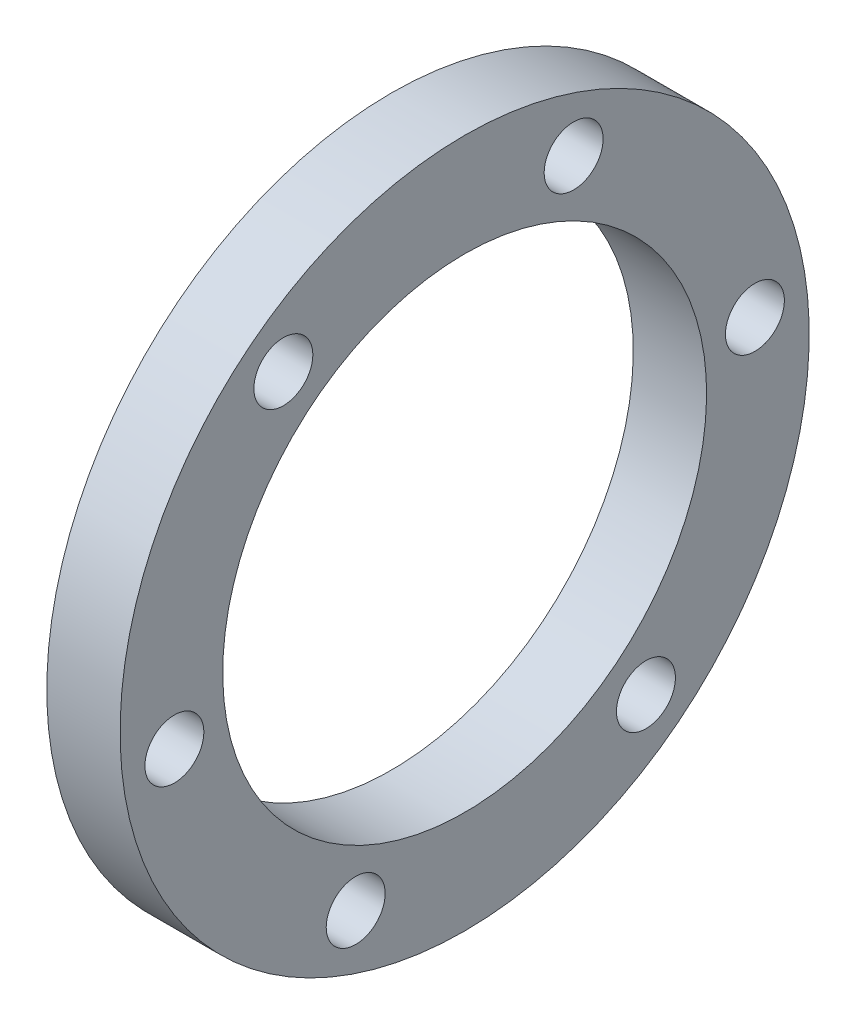
ISO-10303-21;
HEADER;
FILE_DESCRIPTION(('STEP AP214'),'2;1');
FILE_NAME('part.step','',(''),(''),'','','');
FILE_SCHEMA(('AUTOMOTIVE_DESIGN { 1 0 10303 214 1 1 1 1 }'));
ENDSEC;
DATA;
#1=APPLICATION_CONTEXT('core data for automotive mechanical design processes');
#2=APPLICATION_PROTOCOL_DEFINITION('international standard','automotive_design',2000,#1);
#3=PRODUCT_CONTEXT('',#1,'mechanical');
#4=PRODUCT('Part','Part','',(#3));
#5=PRODUCT_RELATED_PRODUCT_CATEGORY('part','',(#4));
#6=PRODUCT_DEFINITION_FORMATION('','',#4);
#7=PRODUCT_DEFINITION_CONTEXT('part definition',#1,'design');
#8=PRODUCT_DEFINITION('design','',#6,#7);
#9=PRODUCT_DEFINITION_SHAPE('','',#8);
#10=(LENGTH_UNIT() NAMED_UNIT(*) SI_UNIT(.MILLI.,.METRE.));
#11=(NAMED_UNIT(*) PLANE_ANGLE_UNIT() SI_UNIT($,.RADIAN.));
#12=(NAMED_UNIT(*) SI_UNIT($,.STERADIAN.) SOLID_ANGLE_UNIT());
#13=UNCERTAINTY_MEASURE_WITH_UNIT(LENGTH_MEASURE(1.E-05),#10,'distance_accuracy_value','');
#14=(GEOMETRIC_REPRESENTATION_CONTEXT(3) GLOBAL_UNCERTAINTY_ASSIGNED_CONTEXT((#13)) GLOBAL_UNIT_ASSIGNED_CONTEXT((#10,
#11,#12)) REPRESENTATION_CONTEXT('',''));
#15=CARTESIAN_POINT('',(0.,0.,0.));
#16=DIRECTION('',(0.,0.,1.));
#17=DIRECTION('',(1.,0.,0.));
#18=AXIS2_PLACEMENT_3D('',#15,#16,#17);
#19=CARTESIAN_POINT('',(-304.8,186.166852461199,298.45));
#20=DIRECTION('',(1.,0.,0.));
#21=DIRECTION('',(0.,1.,0.));
#22=AXIS2_PLACEMENT_3D('',#19,#20,#21);
#23=PLANE('',#22);
#24=CARTESIAN_POINT('',(-304.8,273.344767514925,253.729564328877));
#25=DIRECTION('',(1.,0.,0.));
#26=DIRECTION('',(0.,1.,0.));
#27=AXIS2_PLACEMENT_3D('',#24,#25,#26);
#28=CIRCLE('',#27,2.5527);
#29=CARTESIAN_POINT('',(-304.8,275.897467514925,253.729564328877));
#30=VERTEX_POINT('',#29);
#31=EDGE_CURVE('E42',#30,#30,#28,.F.);
#32=ORIENTED_EDGE('',*,*,#31,.T.);
#33=EDGE_LOOP('',(#32));
#34=FACE_BOUND('',#33,.T.);
#35=CARTESIAN_POINT('',(-304.8,316.890605835365,259.993745438182));
#36=DIRECTION('',(1.,0.,0.));
#37=DIRECTION('',(0.,1.,0.));
#38=AXIS2_PLACEMENT_3D('',#35,#36,#37);
#39=CIRCLE('',#38,2.5527);
#40=CARTESIAN_POINT('',(-304.8,319.443305835365,259.993745438182));
#41=VERTEX_POINT('',#40);
#42=EDGE_CURVE('E50',#41,#41,#39,.F.);
#43=ORIENTED_EDGE('',*,*,#42,.T.);
#44=EDGE_LOOP('',(#43));
#45=FACE_BOUND('',#44,.T.);
#46=CARTESIAN_POINT('',(-304.8,300.54262664971,219.14985266894));
#47=DIRECTION('',(1.,0.,0.));
#48=DIRECTION('',(0.,1.,0.));
#49=AXIS2_PLACEMENT_3D('',#46,#47,#48);
#50=CIRCLE('',#49,2.5527);
#51=CARTESIAN_POINT('',(-304.8,303.09532664971,219.14985266894));
#52=VERTEX_POINT('',#51);
#53=EDGE_CURVE('E58',#52,#52,#50,.F.);
#54=ORIENTED_EDGE('',*,*,#53,.T.);
#55=EDGE_LOOP('',(#54));
#56=FACE_BOUND('',#55,.T.);
#57=CARTESIAN_POINT('',(-304.8,296.926,244.291054145333));
#58=DIRECTION('',(1.,0.,0.));
#59=DIRECTION('',(0.,1.,0.));
#60=AXIS2_PLACEMENT_3D('',#57,#58,#59);
#61=CIRCLE('',#60,29.845);
#62=CARTESIAN_POINT('',(-304.8,326.771,244.291054145333));
#63=VERTEX_POINT('',#62);
#64=EDGE_CURVE('E19',#63,#63,#61,.T.);
#65=ORIENTED_EDGE('',*,*,#64,.T.);
#66=EDGE_LOOP('',(#65));
#67=FACE_BOUND('',#66,.T.);
#68=CARTESIAN_POINT('',(-304.8,276.961394164635,228.588362852483));
#69=DIRECTION('',(1.,0.,0.));
#70=DIRECTION('',(0.,1.,0.));
#71=AXIS2_PLACEMENT_3D('',#68,#69,#70);
#72=CIRCLE('',#71,2.5527);
#73=CARTESIAN_POINT('',(-304.8,279.514094164635,228.588362852483));
#74=VERTEX_POINT('',#73);
#75=EDGE_CURVE('E60',#74,#74,#72,.F.);
#76=ORIENTED_EDGE('',*,*,#75,.T.);
#77=EDGE_LOOP('',(#76));
#78=FACE_BOUND('',#77,.T.);
#79=CARTESIAN_POINT('',(-304.8,320.507232485074,234.852543961789));
#80=DIRECTION('',(1.,0.,0.));
#81=DIRECTION('',(0.,1.,0.));
#82=AXIS2_PLACEMENT_3D('',#79,#80,#81);
#83=CIRCLE('',#82,2.5527);
#84=CARTESIAN_POINT('',(-304.8,323.059932485074,234.852543961789));
#85=VERTEX_POINT('',#84);
#86=EDGE_CURVE('E54',#85,#85,#83,.F.);
#87=ORIENTED_EDGE('',*,*,#86,.T.);
#88=EDGE_LOOP('',(#87));
#89=FACE_BOUND('',#88,.T.);
#90=CARTESIAN_POINT('',(-304.8,293.30937335029,269.432255621727));
#91=DIRECTION('',(1.,0.,0.));
#92=DIRECTION('',(0.,1.,0.));
#93=AXIS2_PLACEMENT_3D('',#90,#91,#92);
#94=CIRCLE('',#93,2.5527);
#95=CARTESIAN_POINT('',(-304.8,295.86207335029,269.432255621727));
#96=VERTEX_POINT('',#95);
#97=EDGE_CURVE('E46',#96,#96,#94,.F.);
#98=ORIENTED_EDGE('',*,*,#97,.T.);
#99=EDGE_LOOP('',(#98));
#100=FACE_BOUND('',#99,.T.);
#101=CARTESIAN_POINT('',(-304.8,296.926,244.291054145333));
#102=DIRECTION('',(1.,0.,0.));
#103=DIRECTION('',(0.,1.,0.));
#104=AXIS2_PLACEMENT_3D('',#101,#102,#103);
#105=CIRCLE('',#104,20.955);
#106=CARTESIAN_POINT('',(-304.8,317.881,244.291054145333));
#107=VERTEX_POINT('',#106);
#108=EDGE_CURVE('E37',#107,#107,#105,.T.);
#109=ORIENTED_EDGE('',*,*,#108,.F.);
#110=EDGE_LOOP('',(#109));
#111=FACE_BOUND('',#110,.T.);
#112=ADVANCED_FACE('F15',(#34,#45,#56,#67,#78,#89,#100,#111),#23,.T.);
#113=CARTESIAN_POINT('',(-304.798,296.926,244.291054145333));
#114=DIRECTION('',(-1.,0.,0.));
#115=DIRECTION('',(0.,-1.,0.));
#116=AXIS2_PLACEMENT_3D('',#113,#114,#115);
#117=CYLINDRICAL_SURFACE('',#116,20.955);
#118=CARTESIAN_POINT('',(-311.15,296.926,244.291054145333));
#119=DIRECTION('',(1.,0.,0.));
#120=DIRECTION('',(0.,1.,0.));
#121=AXIS2_PLACEMENT_3D('',#118,#119,#120);
#122=CIRCLE('',#121,20.955);
#123=CARTESIAN_POINT('',(-311.15,317.881,244.291054145333));
#124=VERTEX_POINT('',#123);
#125=EDGE_CURVE('E98',#124,#124,#122,.T.);
#126=ORIENTED_EDGE('',*,*,#125,.F.);
#127=EDGE_LOOP('',(#126));
#128=FACE_BOUND('',#127,.T.);
#129=ORIENTED_EDGE('',*,*,#108,.T.);
#130=EDGE_LOOP('',(#129));
#131=FACE_BOUND('',#130,.T.);
#132=ADVANCED_FACE('F17',(#128,#131),#117,.F.);
#133=CARTESIAN_POINT('',(-304.798,273.344767514925,253.729564328877));
#134=DIRECTION('',(-1.,0.,0.));
#135=DIRECTION('',(0.,-1.,0.));
#136=AXIS2_PLACEMENT_3D('',#133,#134,#135);
#137=CYLINDRICAL_SURFACE('',#136,2.5527);
#138=CARTESIAN_POINT('',(-311.15,273.344767514925,253.729564328877));
#139=DIRECTION('',(-1.,0.,0.));
#140=DIRECTION('',(0.,-1.,0.));
#141=AXIS2_PLACEMENT_3D('',#138,#139,#140);
#142=CIRCLE('',#141,2.5527);
#143=CARTESIAN_POINT('',(-311.15,270.792067514925,253.729564328877));
#144=VERTEX_POINT('',#143);
#145=EDGE_CURVE('E103',#144,#144,#142,.T.);
#146=ORIENTED_EDGE('',*,*,#145,.T.);
#147=EDGE_LOOP('',(#146));
#148=FACE_BOUND('',#147,.T.);
#149=ORIENTED_EDGE('',*,*,#31,.F.);
#150=EDGE_LOOP('',(#149));
#151=FACE_BOUND('',#150,.T.);
#152=ADVANCED_FACE('F87',(#148,#151),#137,.F.);
#153=CARTESIAN_POINT('',(-304.798,293.30937335029,269.432255621727));
#154=DIRECTION('',(-1.,0.,0.));
#155=DIRECTION('',(0.,-1.,0.));
#156=AXIS2_PLACEMENT_3D('',#153,#154,#155);
#157=CYLINDRICAL_SURFACE('',#156,2.5527);
#158=CARTESIAN_POINT('',(-311.15,293.30937335029,269.432255621727));
#159=DIRECTION('',(-1.,0.,0.));
#160=DIRECTION('',(0.,-1.,0.));
#161=AXIS2_PLACEMENT_3D('',#158,#159,#160);
#162=CIRCLE('',#161,2.5527);
#163=CARTESIAN_POINT('',(-311.15,290.75667335029,269.432255621727));
#164=VERTEX_POINT('',#163);
#165=EDGE_CURVE('E107',#164,#164,#162,.T.);
#166=ORIENTED_EDGE('',*,*,#165,.T.);
#167=EDGE_LOOP('',(#166));
#168=FACE_BOUND('',#167,.T.);
#169=ORIENTED_EDGE('',*,*,#97,.F.);
#170=EDGE_LOOP('',(#169));
#171=FACE_BOUND('',#170,.T.);
#172=ADVANCED_FACE('F92',(#168,#171),#157,.F.);
#173=CARTESIAN_POINT('',(-304.798,316.890605835365,259.993745438182));
#174=DIRECTION('',(-1.,0.,0.));
#175=DIRECTION('',(0.,-1.,0.));
#176=AXIS2_PLACEMENT_3D('',#173,#174,#175);
#177=CYLINDRICAL_SURFACE('',#176,2.5527);
#178=CARTESIAN_POINT('',(-311.15,316.890605835365,259.993745438182));
#179=DIRECTION('',(-1.,0.,0.));
#180=DIRECTION('',(0.,-1.,0.));
#181=AXIS2_PLACEMENT_3D('',#178,#179,#180);
#182=CIRCLE('',#181,2.5527);
#183=CARTESIAN_POINT('',(-311.15,314.337905835364,259.993745438182));
#184=VERTEX_POINT('',#183);
#185=EDGE_CURVE('E114',#184,#184,#182,.T.);
#186=ORIENTED_EDGE('',*,*,#185,.T.);
#187=EDGE_LOOP('',(#186));
#188=FACE_BOUND('',#187,.T.);
#189=ORIENTED_EDGE('',*,*,#42,.F.);
#190=EDGE_LOOP('',(#189));
#191=FACE_BOUND('',#190,.T.);
#192=ADVANCED_FACE('F144',(#188,#191),#177,.F.);
#193=CARTESIAN_POINT('',(-304.798,320.507232485074,234.852543961789));
#194=DIRECTION('',(-1.,0.,0.));
#195=DIRECTION('',(0.,-1.,0.));
#196=AXIS2_PLACEMENT_3D('',#193,#194,#195);
#197=CYLINDRICAL_SURFACE('',#196,2.5527);
#198=CARTESIAN_POINT('',(-311.15,320.507232485074,234.852543961789));
#199=DIRECTION('',(-1.,0.,0.));
#200=DIRECTION('',(0.,-1.,0.));
#201=AXIS2_PLACEMENT_3D('',#198,#199,#200);
#202=CIRCLE('',#201,2.5527);
#203=CARTESIAN_POINT('',(-311.15,317.954532485074,234.852543961789));
#204=VERTEX_POINT('',#203);
#205=EDGE_CURVE('E33',#204,#204,#202,.T.);
#206=ORIENTED_EDGE('',*,*,#205,.T.);
#207=EDGE_LOOP('',(#206));
#208=FACE_BOUND('',#207,.T.);
#209=ORIENTED_EDGE('',*,*,#86,.F.);
#210=EDGE_LOOP('',(#209));
#211=FACE_BOUND('',#210,.T.);
#212=ADVANCED_FACE('F121',(#208,#211),#197,.F.);
#213=CARTESIAN_POINT('',(-304.798,300.54262664971,219.14985266894));
#214=DIRECTION('',(-1.,0.,0.));
#215=DIRECTION('',(0.,-1.,0.));
#216=AXIS2_PLACEMENT_3D('',#213,#214,#215);
#217=CYLINDRICAL_SURFACE('',#216,2.5527);
#218=CARTESIAN_POINT('',(-311.15,300.54262664971,219.14985266894));
#219=DIRECTION('',(-1.,0.,0.));
#220=DIRECTION('',(0.,-1.,0.));
#221=AXIS2_PLACEMENT_3D('',#218,#219,#220);
#222=CIRCLE('',#221,2.5527);
#223=CARTESIAN_POINT('',(-311.15,297.98992664971,219.14985266894));
#224=VERTEX_POINT('',#223);
#225=EDGE_CURVE('E24',#224,#224,#222,.T.);
#226=ORIENTED_EDGE('',*,*,#225,.T.);
#227=EDGE_LOOP('',(#226));
#228=FACE_BOUND('',#227,.T.);
#229=ORIENTED_EDGE('',*,*,#53,.F.);
#230=EDGE_LOOP('',(#229));
#231=FACE_BOUND('',#230,.T.);
#232=ADVANCED_FACE('F82',(#228,#231),#217,.F.);
#233=CARTESIAN_POINT('',(-304.798,276.961394164635,228.588362852483));
#234=DIRECTION('',(-1.,0.,0.));
#235=DIRECTION('',(0.,-1.,0.));
#236=AXIS2_PLACEMENT_3D('',#233,#234,#235);
#237=CYLINDRICAL_SURFACE('',#236,2.5527);
#238=CARTESIAN_POINT('',(-311.15,276.961394164635,228.588362852483));
#239=DIRECTION('',(-1.,0.,0.));
#240=DIRECTION('',(0.,-1.,0.));
#241=AXIS2_PLACEMENT_3D('',#238,#239,#240);
#242=CIRCLE('',#241,2.5527);
#243=CARTESIAN_POINT('',(-311.15,274.408694164635,228.588362852483));
#244=VERTEX_POINT('',#243);
#245=EDGE_CURVE('E10',#244,#244,#242,.T.);
#246=ORIENTED_EDGE('',*,*,#245,.T.);
#247=EDGE_LOOP('',(#246));
#248=FACE_BOUND('',#247,.T.);
#249=ORIENTED_EDGE('',*,*,#75,.F.);
#250=EDGE_LOOP('',(#249));
#251=FACE_BOUND('',#250,.T.);
#252=ADVANCED_FACE('F73',(#248,#251),#237,.F.);
#253=CARTESIAN_POINT('',(-304.798,296.926,244.291054145333));
#254=DIRECTION('',(-1.,0.,0.));
#255=DIRECTION('',(0.,-1.,0.));
#256=AXIS2_PLACEMENT_3D('',#253,#254,#255);
#257=CYLINDRICAL_SURFACE('',#256,29.845);
#258=CARTESIAN_POINT('',(-311.15,296.926,244.291054145333));
#259=DIRECTION('',(1.,0.,0.));
#260=DIRECTION('',(0.,1.,0.));
#261=AXIS2_PLACEMENT_3D('',#258,#259,#260);
#262=CIRCLE('',#261,29.845);
#263=CARTESIAN_POINT('',(-311.15,326.771,244.291054145333));
#264=VERTEX_POINT('',#263);
#265=EDGE_CURVE('E41',#264,#264,#262,.T.);
#266=ORIENTED_EDGE('',*,*,#265,.T.);
#267=EDGE_LOOP('',(#266));
#268=FACE_BOUND('',#267,.T.);
#269=ORIENTED_EDGE('',*,*,#64,.F.);
#270=EDGE_LOOP('',(#269));
#271=FACE_BOUND('',#270,.T.);
#272=ADVANCED_FACE('F70',(#268,#271),#257,.T.);
#273=CARTESIAN_POINT('',(-311.15,186.166852461199,298.45));
#274=DIRECTION('',(1.,0.,0.));
#275=DIRECTION('',(0.,1.,0.));
#276=AXIS2_PLACEMENT_3D('',#273,#274,#275);
#277=PLANE('',#276);
#278=ORIENTED_EDGE('',*,*,#245,.F.);
#279=EDGE_LOOP('',(#278));
#280=FACE_BOUND('',#279,.T.);
#281=ORIENTED_EDGE('',*,*,#225,.F.);
#282=EDGE_LOOP('',(#281));
#283=FACE_BOUND('',#282,.T.);
#284=ORIENTED_EDGE('',*,*,#205,.F.);
#285=EDGE_LOOP('',(#284));
#286=FACE_BOUND('',#285,.T.);
#287=ORIENTED_EDGE('',*,*,#185,.F.);
#288=EDGE_LOOP('',(#287));
#289=FACE_BOUND('',#288,.T.);
#290=ORIENTED_EDGE('',*,*,#165,.F.);
#291=EDGE_LOOP('',(#290));
#292=FACE_BOUND('',#291,.T.);
#293=ORIENTED_EDGE('',*,*,#145,.F.);
#294=EDGE_LOOP('',(#293));
#295=FACE_BOUND('',#294,.T.);
#296=ORIENTED_EDGE('',*,*,#125,.T.);
#297=EDGE_LOOP('',(#296));
#298=FACE_BOUND('',#297,.T.);
#299=ORIENTED_EDGE('',*,*,#265,.F.);
#300=EDGE_LOOP('',(#299));
#301=FACE_BOUND('',#300,.T.);
#302=ADVANCED_FACE('F72',(#280,#283,#286,#289,#292,#295,#298,#301),#277,.F.);
#303=CLOSED_SHELL('',(#112,#132,#152,#172,#192,#212,#232,#252,#272,#302));
#304=MANIFOLD_SOLID_BREP('B1',#303);
#305=ADVANCED_BREP_SHAPE_REPRESENTATION('',(#18,#304),#14);
#306=SHAPE_DEFINITION_REPRESENTATION(#9,#305);
ENDSEC;
END-ISO-10303-21;
